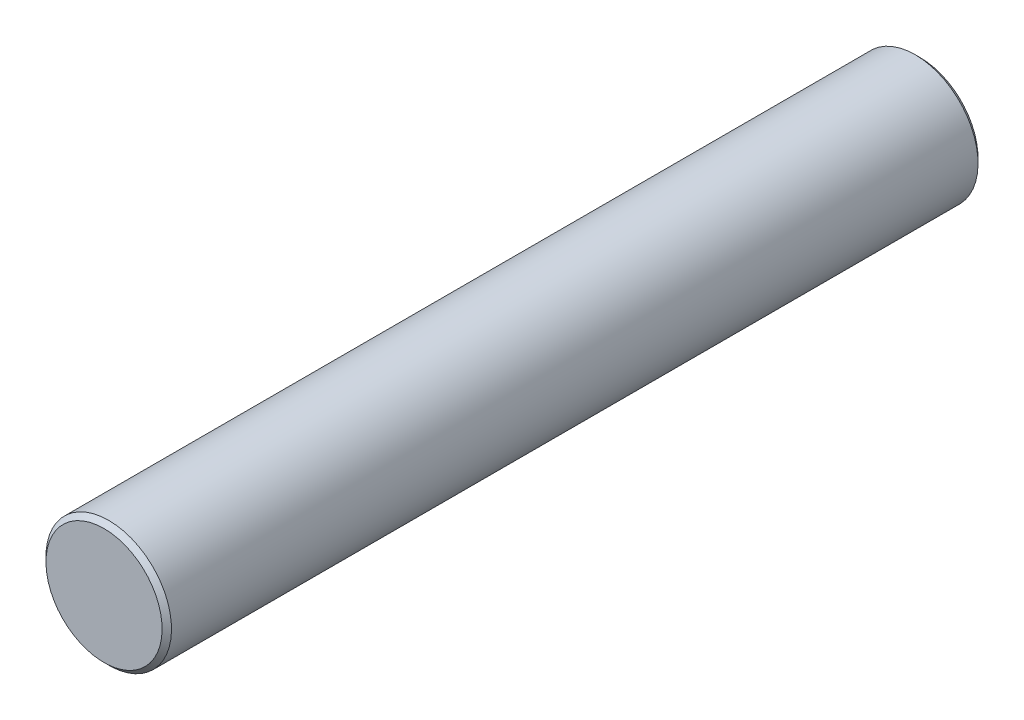
ISO-10303-21;
HEADER;
FILE_DESCRIPTION(('STEP AP214'),'2;1');
FILE_NAME('part.step','',(''),(''),'','','');
FILE_SCHEMA(('AUTOMOTIVE_DESIGN { 1 0 10303 214 1 1 1 1 }'));
ENDSEC;
DATA;
#1=APPLICATION_CONTEXT('core data for automotive mechanical design processes');
#2=APPLICATION_PROTOCOL_DEFINITION('international standard','automotive_design',2000,#1);
#3=PRODUCT_CONTEXT('',#1,'mechanical');
#4=PRODUCT('Part','Part','',(#3));
#5=PRODUCT_RELATED_PRODUCT_CATEGORY('part','',(#4));
#6=PRODUCT_DEFINITION_FORMATION('','',#4);
#7=PRODUCT_DEFINITION_CONTEXT('part definition',#1,'design');
#8=PRODUCT_DEFINITION('design','',#6,#7);
#9=PRODUCT_DEFINITION_SHAPE('','',#8);
#10=(LENGTH_UNIT() NAMED_UNIT(*) SI_UNIT(.MILLI.,.METRE.));
#11=(NAMED_UNIT(*) PLANE_ANGLE_UNIT() SI_UNIT($,.RADIAN.));
#12=(NAMED_UNIT(*) SI_UNIT($,.STERADIAN.) SOLID_ANGLE_UNIT());
#13=UNCERTAINTY_MEASURE_WITH_UNIT(LENGTH_MEASURE(1.E-05),#10,'distance_accuracy_value','');
#14=(GEOMETRIC_REPRESENTATION_CONTEXT(3) GLOBAL_UNCERTAINTY_ASSIGNED_CONTEXT((#13)) GLOBAL_UNIT_ASSIGNED_CONTEXT((#10,
#11,#12)) REPRESENTATION_CONTEXT('',''));
#15=CARTESIAN_POINT('',(0.,0.,0.));
#16=DIRECTION('',(0.,0.,1.));
#17=DIRECTION('',(1.,0.,0.));
#18=AXIS2_PLACEMENT_3D('',#15,#16,#17);
#19=CARTESIAN_POINT('',(0.,9.25,0.));
#20=DIRECTION('',(0.,0.,-1.));
#21=DIRECTION('',(0.,1.,0.));
#22=AXIS2_PLACEMENT_3D('',#19,#20,#21);
#23=PLANE('',#22);
#24=CARTESIAN_POINT('',(0.,0.,0.));
#25=DIRECTION('',(0.,0.,-1.));
#26=DIRECTION('',(0.,1.,0.));
#27=AXIS2_PLACEMENT_3D('',#24,#25,#26);
#28=CIRCLE('',#27,18.5);
#29=CARTESIAN_POINT('',(0.,18.5,0.));
#30=VERTEX_POINT('',#29);
#31=EDGE_CURVE('E9',#30,#30,#28,.T.);
#32=ORIENTED_EDGE('',*,*,#31,.T.);
#33=EDGE_LOOP('',(#32));
#34=FACE_BOUND('',#33,.T.);
#35=CARTESIAN_POINT('',(0.,0.,0.));
#36=DIRECTION('',(0.,0.,1.));
#37=DIRECTION('',(-1.,0.,0.));
#38=AXIS2_PLACEMENT_3D('',#35,#36,#37);
#39=CIRCLE('',#38,6.);
#40=CARTESIAN_POINT('',(-6.,0.,0.));
#41=VERTEX_POINT('',#40);
#42=EDGE_CURVE('E52',#41,#41,#39,.T.);
#43=ORIENTED_EDGE('',*,*,#42,.T.);
#44=EDGE_LOOP('',(#43));
#45=FACE_BOUND('',#44,.T.);
#46=ADVANCED_FACE('F15',(#34,#45),#23,.T.);
#47=CARTESIAN_POINT('',(0.,0.,0.75));
#48=DIRECTION('',(0.,0.,1.));
#49=DIRECTION('',(0.,1.,0.));
#50=AXIS2_PLACEMENT_3D('',#47,#48,#49);
#51=CONICAL_SURFACE('',#50,19.25,0.785398163397448);
#52=CARTESIAN_POINT('',(0.,0.,1.5));
#53=DIRECTION('',(0.,0.,-1.));
#54=DIRECTION('',(0.,1.,0.));
#55=AXIS2_PLACEMENT_3D('',#52,#53,#54);
#56=CIRCLE('',#55,20.);
#57=CARTESIAN_POINT('',(0.,20.,1.5));
#58=VERTEX_POINT('',#57);
#59=EDGE_CURVE('E25',#58,#58,#56,.T.);
#60=ORIENTED_EDGE('',*,*,#59,.T.);
#61=EDGE_LOOP('',(#60));
#62=FACE_BOUND('',#61,.T.);
#63=ORIENTED_EDGE('',*,*,#31,.F.);
#64=EDGE_LOOP('',(#63));
#65=FACE_BOUND('',#64,.T.);
#66=ADVANCED_FACE('F121',(#62,#65),#51,.T.);
#67=CARTESIAN_POINT('',(0.,0.,130.));
#68=DIRECTION('',(0.,0.,1.));
#69=DIRECTION('',(0.,1.,0.));
#70=AXIS2_PLACEMENT_3D('',#67,#68,#69);
#71=CYLINDRICAL_SURFACE('',#70,20.);
#72=CARTESIAN_POINT('',(0.,0.,258.5));
#73=DIRECTION('',(0.,0.,-1.));
#74=DIRECTION('',(0.,1.,0.));
#75=AXIS2_PLACEMENT_3D('',#72,#73,#74);
#76=CIRCLE('',#75,20.);
#77=CARTESIAN_POINT('',(0.,20.,258.5));
#78=VERTEX_POINT('',#77);
#79=EDGE_CURVE('E19',#78,#78,#76,.T.);
#80=ORIENTED_EDGE('',*,*,#79,.T.);
#81=EDGE_LOOP('',(#80));
#82=FACE_BOUND('',#81,.T.);
#83=ORIENTED_EDGE('',*,*,#59,.F.);
#84=EDGE_LOOP('',(#83));
#85=FACE_BOUND('',#84,.T.);
#86=CARTESIAN_POINT('',(0.,0.,6.5));
#87=DIRECTION('',(0.,0.,-1.));
#88=DIRECTION('',(0.,1.,0.));
#89=AXIS2_PLACEMENT_3D('',#86,#87,#88);
#90=CIRCLE('',#89,20.);
#91=CARTESIAN_POINT('',(10.5356537528527,-17.,6.5));
#92=VERTEX_POINT('',#91);
#93=CARTESIAN_POINT('',(-10.5356537528527,-17.,6.5));
#94=VERTEX_POINT('',#93);
#95=EDGE_CURVE('E69',#92,#94,#90,.T.);
#96=ORIENTED_EDGE('',*,*,#95,.T.);
#97=DIRECTION('',(0.,0.,1.));
#98=VECTOR('',#97,1.);
#99=CARTESIAN_POINT('',(-10.5356537528527,-17.,8.25));
#100=LINE('',#99,#98);
#101=CARTESIAN_POINT('',(-10.5356537528527,-17.,10.));
#102=VERTEX_POINT('',#101);
#103=EDGE_CURVE('E62',#94,#102,#100,.T.);
#104=ORIENTED_EDGE('',*,*,#103,.T.);
#105=CARTESIAN_POINT('',(0.,0.,10.));
#106=DIRECTION('',(0.,0.,1.));
#107=DIRECTION('',(0.,1.,0.));
#108=AXIS2_PLACEMENT_3D('',#105,#106,#107);
#109=CIRCLE('',#108,20.);
#110=CARTESIAN_POINT('',(10.5356537528527,-17.,10.));
#111=VERTEX_POINT('',#110);
#112=EDGE_CURVE('E75',#102,#111,#109,.T.);
#113=ORIENTED_EDGE('',*,*,#112,.T.);
#114=DIRECTION('',(0.,0.,-1.));
#115=VECTOR('',#114,1.);
#116=CARTESIAN_POINT('',(10.5356537528527,-17.,8.25));
#117=LINE('',#116,#115);
#118=EDGE_CURVE('E60',#111,#92,#117,.T.);
#119=ORIENTED_EDGE('',*,*,#118,.T.);
#120=EDGE_LOOP('',(#96,#104,#113,#119));
#121=FACE_BOUND('',#120,.T.);
#122=ADVANCED_FACE('F17',(#82,#85,#121),#71,.T.);
#123=CARTESIAN_POINT('',(0.,0.,259.25));
#124=DIRECTION('',(0.,0.,-1.));
#125=DIRECTION('',(0.,1.,0.));
#126=AXIS2_PLACEMENT_3D('',#123,#124,#125);
#127=CONICAL_SURFACE('',#126,19.25,0.785398163397448);
#128=CARTESIAN_POINT('',(0.,0.,260.));
#129=DIRECTION('',(0.,0.,-1.));
#130=DIRECTION('',(0.,1.,0.));
#131=AXIS2_PLACEMENT_3D('',#128,#129,#130);
#132=CIRCLE('',#131,18.5);
#133=CARTESIAN_POINT('',(0.,18.5,260.));
#134=VERTEX_POINT('',#133);
#135=EDGE_CURVE('E44',#134,#134,#132,.T.);
#136=ORIENTED_EDGE('',*,*,#135,.T.);
#137=EDGE_LOOP('',(#136));
#138=FACE_BOUND('',#137,.T.);
#139=ORIENTED_EDGE('',*,*,#79,.F.);
#140=EDGE_LOOP('',(#139));
#141=FACE_BOUND('',#140,.T.);
#142=ADVANCED_FACE('F116',(#138,#141),#127,.T.);
#143=CARTESIAN_POINT('',(0.,9.25,260.));
#144=DIRECTION('',(0.,0.,1.));
#145=DIRECTION('',(0.,-1.,0.));
#146=AXIS2_PLACEMENT_3D('',#143,#144,#145);
#147=PLANE('',#146);
#148=ORIENTED_EDGE('',*,*,#135,.F.);
#149=EDGE_LOOP('',(#148));
#150=FACE_BOUND('',#149,.T.);
#151=ADVANCED_FACE('F110',(#150),#147,.T.);
#152=CARTESIAN_POINT('',(0.,0.,26.4586213285198));
#153=DIRECTION('',(0.,0.,-1.));
#154=DIRECTION('',(-1.,0.,0.));
#155=AXIS2_PLACEMENT_3D('',#152,#153,#154);
#156=CONICAL_SURFACE('',#155,2.52640625,1.0471975511966);
#157=CARTESIAN_POINT('',(0.,0.,25.));
#158=DIRECTION('',(0.,0.,1.));
#159=DIRECTION('',(-1.,0.,0.));
#160=AXIS2_PLACEMENT_3D('',#157,#158,#159);
#161=CIRCLE('',#160,5.0528125);
#162=CARTESIAN_POINT('',(-5.0528125,0.,25.));
#163=VERTEX_POINT('',#162);
#164=EDGE_CURVE('E51',#163,#163,#161,.T.);
#165=ORIENTED_EDGE('',*,*,#164,.F.);
#166=EDGE_LOOP('',(#165));
#167=FACE_BOUND('',#166,.T.);
#168=CARTESIAN_POINT('',(0.,0.,27.9172426570397));
#169=VERTEX_POINT('',#168);
#170=VERTEX_LOOP('',#169);
#171=FACE_BOUND('',#170,.T.);
#172=ADVANCED_FACE('F104',(#167,#171),#156,.F.);
#173=CARTESIAN_POINT('',(0.,0.,12.97359375));
#174=DIRECTION('',(0.,0.,-1.));
#175=DIRECTION('',(-1.,0.,0.));
#176=AXIS2_PLACEMENT_3D('',#173,#174,#175);
#177=CYLINDRICAL_SURFACE('',#176,5.0528125);
#178=CARTESIAN_POINT('',(0.,0.,0.9471875));
#179=DIRECTION('',(0.,0.,1.));
#180=DIRECTION('',(-1.,0.,0.));
#181=AXIS2_PLACEMENT_3D('',#178,#179,#180);
#182=CIRCLE('',#181,5.0528125);
#183=CARTESIAN_POINT('',(-5.0528125,0.,0.9471875));
#184=VERTEX_POINT('',#183);
#185=EDGE_CURVE('E57',#184,#184,#182,.T.);
#186=ORIENTED_EDGE('',*,*,#185,.F.);
#187=EDGE_LOOP('',(#186));
#188=FACE_BOUND('',#187,.T.);
#189=ORIENTED_EDGE('',*,*,#164,.T.);
#190=EDGE_LOOP('',(#189));
#191=FACE_BOUND('',#190,.T.);
#192=ADVANCED_FACE('F101',(#188,#191),#177,.F.);
#193=CARTESIAN_POINT('',(0.,0.,0.47359375));
#194=DIRECTION('',(0.,0.,-1.));
#195=DIRECTION('',(-1.,0.,0.));
#196=AXIS2_PLACEMENT_3D('',#193,#194,#195);
#197=CONICAL_SURFACE('',#196,5.52640625,0.785398163397448);
#198=ORIENTED_EDGE('',*,*,#42,.F.);
#199=EDGE_LOOP('',(#198));
#200=FACE_BOUND('',#199,.T.);
#201=ORIENTED_EDGE('',*,*,#185,.T.);
#202=EDGE_LOOP('',(#201));
#203=FACE_BOUND('',#202,.T.);
#204=ADVANCED_FACE('F99',(#200,#203),#197,.F.);
#205=CARTESIAN_POINT('',(0.,-17.,8.25));
#206=DIRECTION('',(0.,-1.,0.));
#207=DIRECTION('',(0.,0.,-1.));
#208=AXIS2_PLACEMENT_3D('',#205,#206,#207);
#209=PLANE('',#208);
#210=ORIENTED_EDGE('',*,*,#103,.F.);
#211=DIRECTION('',(1.,0.,0.));
#212=VECTOR('',#211,1.);
#213=CARTESIAN_POINT('',(0.,-17.,6.5));
#214=LINE('',#213,#212);
#215=EDGE_CURVE('E66',#94,#92,#214,.T.);
#216=ORIENTED_EDGE('',*,*,#215,.T.);
#217=ORIENTED_EDGE('',*,*,#118,.F.);
#218=DIRECTION('',(-1.,0.,0.));
#219=VECTOR('',#218,1.);
#220=CARTESIAN_POINT('',(0.,-17.,10.));
#221=LINE('',#220,#219);
#222=EDGE_CURVE('E72',#111,#102,#221,.T.);
#223=ORIENTED_EDGE('',*,*,#222,.T.);
#224=EDGE_LOOP('',(#210,#216,#217,#223));
#225=FACE_BOUND('',#224,.T.);
#226=ADVANCED_FACE('F131',(#225),#209,.T.);
#227=CARTESIAN_POINT('',(0.,-19.5,6.5));
#228=DIRECTION('',(0.,0.,1.));
#229=DIRECTION('',(1.,0.,0.));
#230=AXIS2_PLACEMENT_3D('',#227,#228,#229);
#231=PLANE('',#230);
#232=ORIENTED_EDGE('',*,*,#95,.F.);
#233=ORIENTED_EDGE('',*,*,#215,.F.);
#234=EDGE_LOOP('',(#232,#233));
#235=FACE_BOUND('',#234,.T.);
#236=ADVANCED_FACE('F135',(#235),#231,.T.);
#237=CARTESIAN_POINT('',(0.,-19.5,10.));
#238=DIRECTION('',(0.,0.,1.));
#239=DIRECTION('',(1.,0.,0.));
#240=AXIS2_PLACEMENT_3D('',#237,#238,#239);
#241=PLANE('',#240);
#242=ORIENTED_EDGE('',*,*,#112,.F.);
#243=ORIENTED_EDGE('',*,*,#222,.F.);
#244=EDGE_LOOP('',(#242,#243));
#245=FACE_BOUND('',#244,.T.);
#246=ADVANCED_FACE('F87',(#245),#241,.F.);
#247=CLOSED_SHELL('',(#46,#66,#122,#142,#151,#172,#192,#204,#226,#236,#246));
#248=MANIFOLD_SOLID_BREP('B1',#247);
#249=ADVANCED_BREP_SHAPE_REPRESENTATION('',(#18,#248),#14);
#250=SHAPE_DEFINITION_REPRESENTATION(#9,#249);
ENDSEC;
END-ISO-10303-21;
